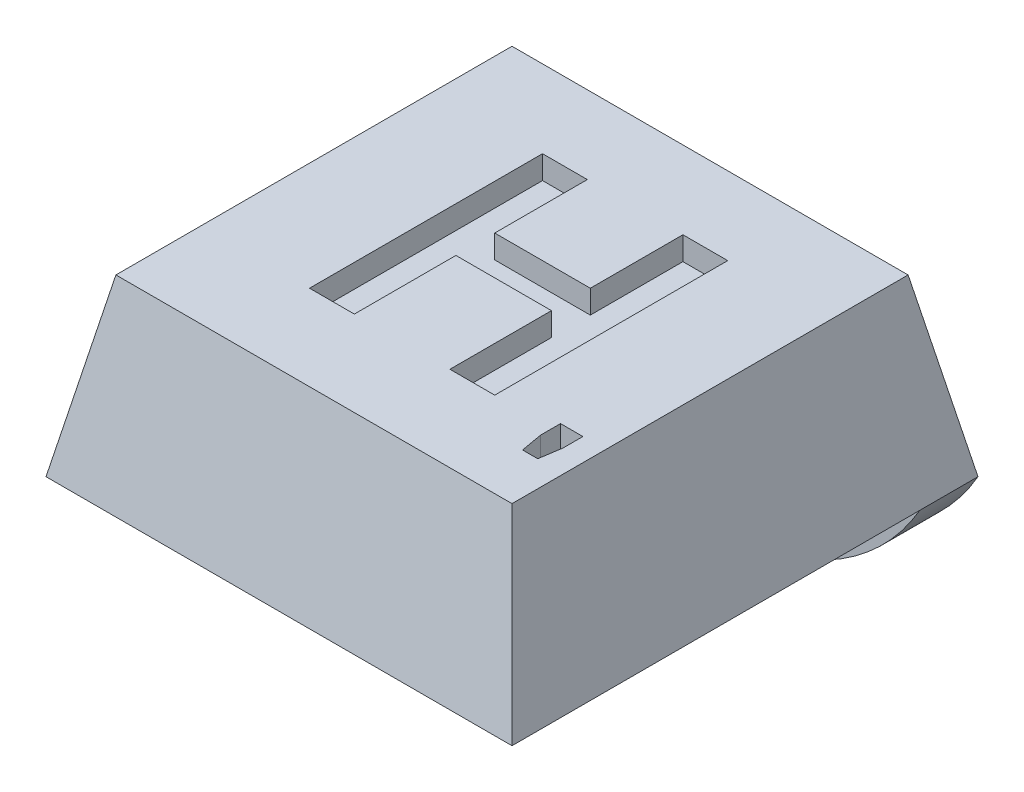
ISO-10303-21;
HEADER;
FILE_DESCRIPTION(('STEP AP214'),'2;1');
FILE_NAME('part.step','',(''),(''),'','','');
FILE_SCHEMA(('AUTOMOTIVE_DESIGN { 1 0 10303 214 1 1 1 1 }'));
ENDSEC;
DATA;
#1=APPLICATION_CONTEXT('core data for automotive mechanical design processes');
#2=APPLICATION_PROTOCOL_DEFINITION('international standard','automotive_design',2000,#1);
#3=PRODUCT_CONTEXT('',#1,'mechanical');
#4=PRODUCT('Part','Part','',(#3));
#5=PRODUCT_RELATED_PRODUCT_CATEGORY('part','',(#4));
#6=PRODUCT_DEFINITION_FORMATION('','',#4);
#7=PRODUCT_DEFINITION_CONTEXT('part definition',#1,'design');
#8=PRODUCT_DEFINITION('design','',#6,#7);
#9=PRODUCT_DEFINITION_SHAPE('','',#8);
#10=(LENGTH_UNIT() NAMED_UNIT(*) SI_UNIT(.MILLI.,.METRE.));
#11=(NAMED_UNIT(*) PLANE_ANGLE_UNIT() SI_UNIT($,.RADIAN.));
#12=(NAMED_UNIT(*) SI_UNIT($,.STERADIAN.) SOLID_ANGLE_UNIT());
#13=UNCERTAINTY_MEASURE_WITH_UNIT(LENGTH_MEASURE(1.E-05),#10,'distance_accuracy_value','');
#14=(GEOMETRIC_REPRESENTATION_CONTEXT(3) GLOBAL_UNCERTAINTY_ASSIGNED_CONTEXT((#13)) GLOBAL_UNIT_ASSIGNED_CONTEXT((#10,
#11,#12)) REPRESENTATION_CONTEXT('',''));
#15=CARTESIAN_POINT('',(0.,0.,0.));
#16=DIRECTION('',(0.,0.,1.));
#17=DIRECTION('',(1.,0.,0.));
#18=AXIS2_PLACEMENT_3D('',#15,#16,#17);
#19=CARTESIAN_POINT('',(0.,3.,0.));
#20=DIRECTION('',(0.,-1.,0.));
#21=DIRECTION('',(0.,0.,-1.));
#22=AXIS2_PLACEMENT_3D('',#19,#20,#21);
#23=PLANE('',#22);
#24=DIRECTION('',(-1.,0.,0.));
#25=VECTOR('',#24,1.);
#26=CARTESIAN_POINT('',(3.22863627000197,3.,-2.06454333683485));
#27=LINE('',#26,#25);
#28=CARTESIAN_POINT('',(3.22863627000197,3.,-2.06454333683485));
#29=VERTEX_POINT('',#28);
#30=CARTESIAN_POINT('',(2.4594055007712,3.,-2.06454333683485));
#31=VERTEX_POINT('',#30);
#32=EDGE_CURVE('E67',#29,#31,#27,.T.);
#33=ORIENTED_EDGE('',*,*,#32,.T.);
#34=DIRECTION('',(0.,0.,-1.));
#35=VECTOR('',#34,1.);
#36=CARTESIAN_POINT('',(2.4594055007712,3.,-2.06454333683485));
#37=LINE('',#36,#35);
#38=CARTESIAN_POINT('',(2.4594055007712,3.,-6.06454333683485));
#39=VERTEX_POINT('',#38);
#40=EDGE_CURVE('E240',#31,#39,#37,.T.);
#41=ORIENTED_EDGE('',*,*,#40,.T.);
#42=DIRECTION('',(1.,0.,0.));
#43=VECTOR('',#42,1.);
#44=CARTESIAN_POINT('',(2.4594055007712,3.,-6.06454333683485));
#45=LINE('',#44,#43);
#46=CARTESIAN_POINT('',(3.22863627000197,3.,-6.06454333683485));
#47=VERTEX_POINT('',#46);
#48=EDGE_CURVE('E288',#39,#47,#45,.T.);
#49=ORIENTED_EDGE('',*,*,#48,.T.);
#50=DIRECTION('',(0.,0.,1.));
#51=VECTOR('',#50,1.);
#52=CARTESIAN_POINT('',(3.22863627000197,3.,-6.06454333683485));
#53=LINE('',#52,#51);
#54=CARTESIAN_POINT('',(3.22863627000197,3.,-4.47479974709126));
#55=VERTEX_POINT('',#54);
#56=EDGE_CURVE('E292',#47,#55,#53,.T.);
#57=ORIENTED_EDGE('',*,*,#56,.T.);
#58=DIRECTION('',(1.,0.,0.));
#59=VECTOR('',#58,1.);
#60=CARTESIAN_POINT('',(3.22863627000197,3.,-4.47479974709126));
#61=LINE('',#60,#59);
#62=CARTESIAN_POINT('',(4.86966191102761,3.,-4.47479974709126));
#63=VERTEX_POINT('',#62);
#64=EDGE_CURVE('E296',#55,#63,#61,.T.);
#65=ORIENTED_EDGE('',*,*,#64,.T.);
#66=DIRECTION('',(0.,0.,-1.));
#67=VECTOR('',#66,1.);
#68=CARTESIAN_POINT('',(4.86966191102761,3.,-4.47479974709126));
#69=LINE('',#68,#67);
#70=CARTESIAN_POINT('',(4.86966191102761,3.,-6.06454333683485));
#71=VERTEX_POINT('',#70);
#72=EDGE_CURVE('E300',#63,#71,#69,.T.);
#73=ORIENTED_EDGE('',*,*,#72,.T.);
#74=DIRECTION('',(1.,0.,0.));
#75=VECTOR('',#74,1.);
#76=CARTESIAN_POINT('',(4.86966191102761,3.,-6.06454333683485));
#77=LINE('',#76,#75);
#78=CARTESIAN_POINT('',(5.63889268025838,3.,-6.06454333683485));
#79=VERTEX_POINT('',#78);
#80=EDGE_CURVE('E304',#71,#79,#77,.T.);
#81=ORIENTED_EDGE('',*,*,#80,.T.);
#82=DIRECTION('',(0.,0.,1.));
#83=VECTOR('',#82,1.);
#84=CARTESIAN_POINT('',(5.63889268025838,3.,-6.06454333683485));
#85=LINE('',#84,#83);
#86=CARTESIAN_POINT('',(5.63889268025838,3.,-2.06454333683485));
#87=VERTEX_POINT('',#86);
#88=EDGE_CURVE('E308',#79,#87,#85,.T.);
#89=ORIENTED_EDGE('',*,*,#88,.T.);
#90=DIRECTION('',(-1.,0.,0.));
#91=VECTOR('',#90,1.);
#92=CARTESIAN_POINT('',(5.63889268025838,3.,-2.06454333683485));
#93=LINE('',#92,#91);
#94=CARTESIAN_POINT('',(4.86966191102761,3.,-2.06454333683485));
#95=VERTEX_POINT('',#94);
#96=EDGE_CURVE('E312',#87,#95,#93,.T.);
#97=ORIENTED_EDGE('',*,*,#96,.T.);
#98=DIRECTION('',(0.,0.,-1.));
#99=VECTOR('',#98,1.);
#100=CARTESIAN_POINT('',(4.86966191102761,3.,-2.06454333683485));
#101=LINE('',#100,#99);
#102=CARTESIAN_POINT('',(4.86966191102761,3.,-3.80813308042459));
#103=VERTEX_POINT('',#102);
#104=EDGE_CURVE('E316',#95,#103,#101,.T.);
#105=ORIENTED_EDGE('',*,*,#104,.T.);
#106=DIRECTION('',(-1.,0.,0.));
#107=VECTOR('',#106,1.);
#108=CARTESIAN_POINT('',(4.86966191102761,3.,-3.80813308042459));
#109=LINE('',#108,#107);
#110=CARTESIAN_POINT('',(3.22863627000197,3.,-3.80813308042459));
#111=VERTEX_POINT('',#110);
#112=EDGE_CURVE('E320',#103,#111,#109,.T.);
#113=ORIENTED_EDGE('',*,*,#112,.T.);
#114=DIRECTION('',(0.,0.,1.));
#115=VECTOR('',#114,1.);
#116=CARTESIAN_POINT('',(3.22863627000197,3.,-3.80813308042459));
#117=LINE('',#116,#115);
#118=EDGE_CURVE('E251',#111,#29,#117,.T.);
#119=ORIENTED_EDGE('',*,*,#118,.T.);
#120=EDGE_LOOP('',(#33,#41,#49,#57,#65,#73,#81,#89,#97,#105,#113,#119));
#121=FACE_BOUND('',#120,.T.);
#122=DIRECTION('',(-1.,0.,0.));
#123=VECTOR('',#122,1.);
#124=CARTESIAN_POINT('',(11.,3.,-0.6));
#125=LINE('',#124,#123);
#126=CARTESIAN_POINT('',(7.4,3.,-0.6));
#127=VERTEX_POINT('',#126);
#128=CARTESIAN_POINT('',(0.6,3.,-0.6));
#129=VERTEX_POINT('',#128);
#130=EDGE_CURVE('E387',#127,#129,#125,.T.);
#131=ORIENTED_EDGE('',*,*,#130,.F.);
#132=DIRECTION('',(0.,0.,1.));
#133=VECTOR('',#132,1.);
#134=CARTESIAN_POINT('',(7.4,3.,-8.));
#135=LINE('',#134,#133);
#136=CARTESIAN_POINT('',(7.4,3.,-7.4));
#137=VERTEX_POINT('',#136);
#138=EDGE_CURVE('E400',#137,#127,#135,.T.);
#139=ORIENTED_EDGE('',*,*,#138,.F.);
#140=DIRECTION('',(-1.,0.,0.));
#141=VECTOR('',#140,1.);
#142=CARTESIAN_POINT('',(11.,3.,-7.4));
#143=LINE('',#142,#141);
#144=CARTESIAN_POINT('',(0.599999999999999,3.,-7.4));
#145=VERTEX_POINT('',#144);
#146=EDGE_CURVE('E383',#137,#145,#143,.T.);
#147=ORIENTED_EDGE('',*,*,#146,.T.);
#148=DIRECTION('',(0.,0.,1.));
#149=VECTOR('',#148,1.);
#150=CARTESIAN_POINT('',(0.6,3.,-8.));
#151=LINE('',#150,#149);
#152=EDGE_CURVE('E403',#145,#129,#151,.T.);
#153=ORIENTED_EDGE('',*,*,#152,.T.);
#154=EDGE_LOOP('',(#131,#139,#147,#153));
#155=FACE_BOUND('',#154,.T.);
#156=DIRECTION('',(-1.,0.,0.));
#157=VECTOR('',#156,1.);
#158=CARTESIAN_POINT('',(6.95345110897488,3.,-1.48827418732116));
#159=LINE('',#158,#157);
#160=CARTESIAN_POINT('',(6.95345110897488,3.,-1.48827418732116));
#161=VERTEX_POINT('',#160);
#162=CARTESIAN_POINT('',(6.69303444230821,3.,-1.48827418732116));
#163=VERTEX_POINT('',#162);
#164=EDGE_CURVE('E59',#161,#163,#159,.T.);
#165=ORIENTED_EDGE('',*,*,#164,.T.);
#166=DIRECTION('',(-0.174084452164286,0.,-0.984730726399182));
#167=VECTOR('',#166,1.);
#168=CARTESIAN_POINT('',(6.69303444230821,3.,-1.48827418732116));
#169=LINE('',#168,#167);
#170=CARTESIAN_POINT('',(6.6265280320518,3.,-1.86447611039809));
#171=VERTEX_POINT('',#170);
#172=EDGE_CURVE('E234',#163,#171,#169,.T.);
#173=ORIENTED_EDGE('',*,*,#172,.T.);
#174=DIRECTION('',(0.,0.,-1.));
#175=VECTOR('',#174,1.);
#176=CARTESIAN_POINT('',(6.6265280320518,3.,-1.86447611039809));
#177=LINE('',#176,#175);
#178=CARTESIAN_POINT('',(6.6265280320518,3.,-2.20622290526988));
#179=VERTEX_POINT('',#178);
#180=EDGE_CURVE('E507',#171,#179,#177,.T.);
#181=ORIENTED_EDGE('',*,*,#180,.T.);
#182=DIRECTION('',(1.,0.,0.));
#183=VECTOR('',#182,1.);
#184=CARTESIAN_POINT('',(6.6265280320518,3.,-2.20622290526988));
#185=LINE('',#184,#183);
#186=CARTESIAN_POINT('',(7.01114341666719,3.,-2.20622290526988));
#187=VERTEX_POINT('',#186);
#188=EDGE_CURVE('E515',#179,#187,#185,.T.);
#189=ORIENTED_EDGE('',*,*,#188,.T.);
#190=DIRECTION('',(0.,0.,1.));
#191=VECTOR('',#190,1.);
#192=CARTESIAN_POINT('',(7.01114341666719,3.,-2.20622290526988));
#193=LINE('',#192,#191);
#194=CARTESIAN_POINT('',(7.01114341666719,3.,-1.86447611039809));
#195=VERTEX_POINT('',#194);
#196=EDGE_CURVE('E519',#187,#195,#193,.T.);
#197=ORIENTED_EDGE('',*,*,#196,.T.);
#198=DIRECTION('',(-0.151582558519476,0.,0.98844460034576));
#199=VECTOR('',#198,1.);
#200=CARTESIAN_POINT('',(7.01114341666719,3.,-1.86447611039809));
#201=LINE('',#200,#199);
#202=EDGE_CURVE('E230',#195,#161,#201,.T.);
#203=ORIENTED_EDGE('',*,*,#202,.T.);
#204=EDGE_LOOP('',(#165,#173,#181,#189,#197,#203));
#205=FACE_BOUND('',#204,.T.);
#206=ADVANCED_FACE('F43',(#121,#155,#205),#23,.F.);
#207=CARTESIAN_POINT('',(8.,0.,-8.));
#208=DIRECTION('',(-0.98058067569092,-0.196116135138184,0.));
#209=DIRECTION('',(0.196116135138184,-0.98058067569092,0.));
#210=AXIS2_PLACEMENT_3D('',#207,#208,#209);
#211=PLANE('',#210);
#212=DIRECTION('',(-0.192450089729875,0.962250448649376,-0.192450089729875));
#213=VECTOR('',#212,1.);
#214=CARTESIAN_POINT('',(7.7037037037037,1.48148148148148,-0.296296296296296));
#215=LINE('',#214,#213);
#216=CARTESIAN_POINT('',(8.,0.,0.));
#217=VERTEX_POINT('',#216);
#218=EDGE_CURVE('E397',#217,#127,#215,.T.);
#219=ORIENTED_EDGE('',*,*,#218,.F.);
#220=DIRECTION('',(0.,0.,-1.));
#221=VECTOR('',#220,1.);
#222=CARTESIAN_POINT('',(8.,0.,0.));
#223=LINE('',#222,#221);
#224=CARTESIAN_POINT('',(8.,0.,-7.));
#225=VERTEX_POINT('',#224);
#226=EDGE_CURVE('E416',#217,#225,#223,.T.);
#227=ORIENTED_EDGE('',*,*,#226,.T.);
#228=DIRECTION('',(0.,0.,1.));
#229=VECTOR('',#228,1.);
#230=CARTESIAN_POINT('',(8.,0.,-8.));
#231=LINE('',#230,#229);
#232=CARTESIAN_POINT('',(8.,0.,-8.));
#233=VERTEX_POINT('',#232);
#234=EDGE_CURVE('E362',#233,#225,#231,.T.);
#235=ORIENTED_EDGE('',*,*,#234,.F.);
#236=DIRECTION('',(0.192450089729875,-0.962250448649376,-0.192450089729875));
#237=VECTOR('',#236,1.);
#238=CARTESIAN_POINT('',(8.,0.,-8.));
#239=LINE('',#238,#237);
#240=EDGE_CURVE('E390',#137,#233,#239,.T.);
#241=ORIENTED_EDGE('',*,*,#240,.F.);
#242=ORIENTED_EDGE('',*,*,#138,.T.);
#243=EDGE_LOOP('',(#219,#227,#235,#241,#242));
#244=FACE_BOUND('',#243,.T.);
#245=ADVANCED_FACE('F489',(#244),#211,.F.);
#246=CARTESIAN_POINT('',(0.,0.,-8.));
#247=DIRECTION('',(0.98058067569092,-0.196116135138184,0.));
#248=DIRECTION('',(0.196116135138184,0.98058067569092,0.));
#249=AXIS2_PLACEMENT_3D('',#246,#247,#248);
#250=PLANE('',#249);
#251=DIRECTION('',(-0.192450089729875,-0.962250448649376,0.192450089729875));
#252=VECTOR('',#251,1.);
#253=CARTESIAN_POINT('',(0.296296296296296,1.48148148148148,-0.296296296296296));
#254=LINE('',#253,#252);
#255=CARTESIAN_POINT('',(0.,0.,0.));
#256=VERTEX_POINT('',#255);
#257=EDGE_CURVE('E444',#129,#256,#254,.T.);
#258=ORIENTED_EDGE('',*,*,#257,.F.);
#259=ORIENTED_EDGE('',*,*,#152,.F.);
#260=DIRECTION('',(0.192450089729875,0.962250448649376,0.192450089729875));
#261=VECTOR('',#260,1.);
#262=CARTESIAN_POINT('',(0.,0.,-8.));
#263=LINE('',#262,#261);
#264=CARTESIAN_POINT('',(0.,0.,-8.));
#265=VERTEX_POINT('',#264);
#266=EDGE_CURVE('E415',#265,#145,#263,.T.);
#267=ORIENTED_EDGE('',*,*,#266,.F.);
#268=DIRECTION('',(0.,0.,1.));
#269=VECTOR('',#268,1.);
#270=CARTESIAN_POINT('',(0.,0.,0.));
#271=LINE('',#270,#269);
#272=CARTESIAN_POINT('',(0.,0.,-7.));
#273=VERTEX_POINT('',#272);
#274=EDGE_CURVE('E420',#265,#273,#271,.T.);
#275=ORIENTED_EDGE('',*,*,#274,.T.);
#276=EDGE_CURVE('E407',#273,#256,#271,.T.);
#277=ORIENTED_EDGE('',*,*,#276,.T.);
#278=EDGE_LOOP('',(#258,#259,#267,#275,#277));
#279=FACE_BOUND('',#278,.T.);
#280=ADVANCED_FACE('F469',(#279),#250,.F.);
#281=CARTESIAN_POINT('',(0.,0.,0.));
#282=DIRECTION('',(0.,-1.,0.));
#283=DIRECTION('',(0.,0.,-1.));
#284=AXIS2_PLACEMENT_3D('',#281,#282,#283);
#285=PLANE('',#284);
#286=DIRECTION('',(-1.,0.,0.));
#287=VECTOR('',#286,1.);
#288=CARTESIAN_POINT('',(0.,0.,-7.));
#289=LINE('',#288,#287);
#290=EDGE_CURVE('E368',#225,#273,#289,.T.);
#291=ORIENTED_EDGE('',*,*,#290,.F.);
#292=ORIENTED_EDGE('',*,*,#226,.F.);
#293=DIRECTION('',(1.,0.,0.));
#294=VECTOR('',#293,1.);
#295=CARTESIAN_POINT('',(0.,0.,0.));
#296=LINE('',#295,#294);
#297=EDGE_CURVE('E417',#256,#217,#296,.T.);
#298=ORIENTED_EDGE('',*,*,#297,.F.);
#299=ORIENTED_EDGE('',*,*,#276,.F.);
#300=EDGE_LOOP('',(#291,#292,#298,#299));
#301=FACE_BOUND('',#300,.T.);
#302=CARTESIAN_POINT('',(4.,0.,-3.75));
#303=DIRECTION('',(0.,-1.,0.));
#304=DIRECTION('',(0.,0.,-1.));
#305=AXIS2_PLACEMENT_3D('',#302,#303,#304);
#306=CIRCLE('',#305,1.75);
#307=CARTESIAN_POINT('',(4.,0.,-5.5));
#308=VERTEX_POINT('',#307);
#309=EDGE_CURVE('E372',#308,#308,#306,.T.);
#310=ORIENTED_EDGE('',*,*,#309,.F.);
#311=EDGE_LOOP('',(#310));
#312=FACE_BOUND('',#311,.T.);
#313=ADVANCED_FACE('F484',(#301,#312),#285,.T.);
#314=CARTESIAN_POINT('',(11.,3.,-7.4));
#315=DIRECTION('',(0.,0.196116135138184,-0.98058067569092));
#316=DIRECTION('',(0.,0.98058067569092,0.196116135138184));
#317=AXIS2_PLACEMENT_3D('',#314,#315,#316);
#318=PLANE('',#317);
#319=ORIENTED_EDGE('',*,*,#240,.T.);
#320=DIRECTION('',(-1.,0.,0.));
#321=VECTOR('',#320,1.);
#322=CARTESIAN_POINT('',(0.,0.,-8.));
#323=LINE('',#322,#321);
#324=EDGE_CURVE('E411',#233,#265,#323,.T.);
#325=ORIENTED_EDGE('',*,*,#324,.T.);
#326=ORIENTED_EDGE('',*,*,#266,.T.);
#327=ORIENTED_EDGE('',*,*,#146,.F.);
#328=EDGE_LOOP('',(#319,#325,#326,#327));
#329=FACE_BOUND('',#328,.T.);
#330=ADVANCED_FACE('F464',(#329),#318,.T.);
#331=CARTESIAN_POINT('',(11.,0.,0.));
#332=DIRECTION('',(0.,0.196116135138184,0.98058067569092));
#333=DIRECTION('',(0.,-0.98058067569092,0.196116135138184));
#334=AXIS2_PLACEMENT_3D('',#331,#332,#333);
#335=PLANE('',#334);
#336=ORIENTED_EDGE('',*,*,#218,.T.);
#337=ORIENTED_EDGE('',*,*,#130,.T.);
#338=ORIENTED_EDGE('',*,*,#257,.T.);
#339=ORIENTED_EDGE('',*,*,#297,.T.);
#340=EDGE_LOOP('',(#336,#337,#338,#339));
#341=FACE_BOUND('',#340,.T.);
#342=ADVANCED_FACE('F493',(#341),#335,.T.);
#343=CARTESIAN_POINT('',(4.,0.4,-3.75));
#344=DIRECTION('',(0.,-1.,0.));
#345=DIRECTION('',(0.,0.,-1.));
#346=AXIS2_PLACEMENT_3D('',#343,#344,#345);
#347=CYLINDRICAL_SURFACE('',#346,1.75);
#348=CARTESIAN_POINT('',(4.,0.4,-3.75));
#349=DIRECTION('',(0.,-1.,0.));
#350=DIRECTION('',(0.,0.,-1.));
#351=AXIS2_PLACEMENT_3D('',#348,#349,#350);
#352=CIRCLE('',#351,1.75);
#353=CARTESIAN_POINT('',(4.,0.4,-5.5));
#354=VERTEX_POINT('',#353);
#355=EDGE_CURVE('E379',#354,#354,#352,.T.);
#356=ORIENTED_EDGE('',*,*,#355,.F.);
#357=EDGE_LOOP('',(#356));
#358=FACE_BOUND('',#357,.T.);
#359=ORIENTED_EDGE('',*,*,#309,.T.);
#360=EDGE_LOOP('',(#359));
#361=FACE_BOUND('',#360,.T.);
#362=ADVANCED_FACE('F632',(#358,#361),#347,.F.);
#363=CARTESIAN_POINT('',(4.,0.4,-3.75));
#364=DIRECTION('',(0.,-1.,0.));
#365=DIRECTION('',(0.,0.,-1.));
#366=AXIS2_PLACEMENT_3D('',#363,#364,#365);
#367=PLANE('',#366);
#368=ORIENTED_EDGE('',*,*,#355,.T.);
#369=EDGE_LOOP('',(#368));
#370=FACE_BOUND('',#369,.T.);
#371=ADVANCED_FACE('F629',(#370),#367,.T.);
#372=CARTESIAN_POINT('',(0.,-2.,-8.));
#373=DIRECTION('',(0.,0.,1.));
#374=DIRECTION('',(1.,0.,0.));
#375=AXIS2_PLACEMENT_3D('',#372,#373,#374);
#376=PLANE('',#375);
#377=ORIENTED_EDGE('',*,*,#324,.F.);
#378=CARTESIAN_POINT('',(4.53589838486225,2.,-8.));
#379=DIRECTION('',(0.,0.,1.));
#380=DIRECTION('',(1.,0.,0.));
#381=AXIS2_PLACEMENT_3D('',#378,#379,#380);
#382=CIRCLE('',#381,4.);
#383=CARTESIAN_POINT('',(4.53589838486225,-2.,-8.));
#384=VERTEX_POINT('',#383);
#385=EDGE_CURVE('E11',#233,#384,#382,.F.);
#386=ORIENTED_EDGE('',*,*,#385,.T.);
#387=DIRECTION('',(1.,0.,0.));
#388=VECTOR('',#387,1.);
#389=CARTESIAN_POINT('',(0.,-2.,-8.));
#390=LINE('',#389,#388);
#391=CARTESIAN_POINT('',(3.46410161513775,-2.,-8.));
#392=VERTEX_POINT('',#391);
#393=EDGE_CURVE('E363',#392,#384,#390,.T.);
#394=ORIENTED_EDGE('',*,*,#393,.F.);
#395=CARTESIAN_POINT('',(3.46410161513775,2.,-8.));
#396=DIRECTION('',(0.,0.,1.));
#397=DIRECTION('',(1.,0.,0.));
#398=AXIS2_PLACEMENT_3D('',#395,#396,#397);
#399=CIRCLE('',#398,4.);
#400=EDGE_CURVE('E52',#392,#265,#399,.F.);
#401=ORIENTED_EDGE('',*,*,#400,.T.);
#402=EDGE_LOOP('',(#377,#386,#394,#401));
#403=FACE_BOUND('',#402,.T.);
#404=ADVANCED_FACE('F457',(#403),#376,.F.);
#405=CARTESIAN_POINT('',(0.,-2.,-7.));
#406=DIRECTION('',(0.,0.,-1.));
#407=DIRECTION('',(-1.,0.,0.));
#408=AXIS2_PLACEMENT_3D('',#405,#406,#407);
#409=PLANE('',#408);
#410=DIRECTION('',(-1.,0.,0.));
#411=VECTOR('',#410,1.);
#412=CARTESIAN_POINT('',(0.,-2.,-7.));
#413=LINE('',#412,#411);
#414=CARTESIAN_POINT('',(4.53589838486225,-2.,-7.));
#415=VERTEX_POINT('',#414);
#416=CARTESIAN_POINT('',(3.46410161513775,-2.,-7.));
#417=VERTEX_POINT('',#416);
#418=EDGE_CURVE('E367',#415,#417,#413,.T.);
#419=ORIENTED_EDGE('',*,*,#418,.F.);
#420=CARTESIAN_POINT('',(4.53589838486225,2.,-7.));
#421=DIRECTION('',(0.,0.,-1.));
#422=DIRECTION('',(-1.,0.,0.));
#423=AXIS2_PLACEMENT_3D('',#420,#421,#422);
#424=CIRCLE('',#423,4.);
#425=EDGE_CURVE('E451',#415,#225,#424,.F.);
#426=ORIENTED_EDGE('',*,*,#425,.T.);
#427=ORIENTED_EDGE('',*,*,#290,.T.);
#428=CARTESIAN_POINT('',(3.46410161513775,2.,-7.));
#429=DIRECTION('',(0.,0.,-1.));
#430=DIRECTION('',(-1.,0.,0.));
#431=AXIS2_PLACEMENT_3D('',#428,#429,#430);
#432=CIRCLE('',#431,4.);
#433=EDGE_CURVE('E448',#273,#417,#432,.F.);
#434=ORIENTED_EDGE('',*,*,#433,.T.);
#435=EDGE_LOOP('',(#419,#426,#427,#434));
#436=FACE_BOUND('',#435,.T.);
#437=ADVANCED_FACE('F475',(#436),#409,.F.);
#438=CARTESIAN_POINT('',(0.,-2.,0.));
#439=DIRECTION('',(0.,1.,0.));
#440=DIRECTION('',(0.,0.,1.));
#441=AXIS2_PLACEMENT_3D('',#438,#439,#440);
#442=PLANE('',#441);
#443=ORIENTED_EDGE('',*,*,#393,.T.);
#444=DIRECTION('',(0.,0.,1.));
#445=VECTOR('',#444,1.);
#446=CARTESIAN_POINT('',(4.53589838486225,-2.,0.));
#447=LINE('',#446,#445);
#448=EDGE_CURVE('E443',#384,#415,#447,.T.);
#449=ORIENTED_EDGE('',*,*,#448,.T.);
#450=ORIENTED_EDGE('',*,*,#418,.T.);
#451=DIRECTION('',(0.,0.,-1.));
#452=VECTOR('',#451,1.);
#453=CARTESIAN_POINT('',(3.46410161513775,-2.,0.));
#454=LINE('',#453,#452);
#455=EDGE_CURVE('E439',#417,#392,#454,.T.);
#456=ORIENTED_EDGE('',*,*,#455,.T.);
#457=EDGE_LOOP('',(#443,#449,#450,#456));
#458=FACE_BOUND('',#457,.T.);
#459=ADVANCED_FACE('F478',(#458),#442,.F.);
#460=CARTESIAN_POINT('',(4.53589838486225,2.,-8.));
#461=DIRECTION('',(0.,0.,1.));
#462=DIRECTION('',(1.,0.,0.));
#463=AXIS2_PLACEMENT_3D('',#460,#461,#462);
#464=CYLINDRICAL_SURFACE('',#463,4.);
#465=ORIENTED_EDGE('',*,*,#385,.F.);
#466=ORIENTED_EDGE('',*,*,#234,.T.);
#467=ORIENTED_EDGE('',*,*,#425,.F.);
#468=ORIENTED_EDGE('',*,*,#448,.F.);
#469=EDGE_LOOP('',(#465,#466,#467,#468));
#470=FACE_BOUND('',#469,.T.);
#471=ADVANCED_FACE('F481',(#470),#464,.T.);
#472=CARTESIAN_POINT('',(3.46410161513775,2.,-8.));
#473=DIRECTION('',(0.,0.,-1.));
#474=DIRECTION('',(-1.,0.,0.));
#475=AXIS2_PLACEMENT_3D('',#472,#473,#474);
#476=CYLINDRICAL_SURFACE('',#475,4.);
#477=ORIENTED_EDGE('',*,*,#433,.F.);
#478=ORIENTED_EDGE('',*,*,#274,.F.);
#479=ORIENTED_EDGE('',*,*,#400,.F.);
#480=ORIENTED_EDGE('',*,*,#455,.F.);
#481=EDGE_LOOP('',(#477,#478,#479,#480));
#482=FACE_BOUND('',#481,.T.);
#483=ADVANCED_FACE('F45',(#482),#476,.T.);
#484=CARTESIAN_POINT('',(3.22863627000197,2.6,-2.06454333683485));
#485=DIRECTION('',(0.,0.,-1.));
#486=DIRECTION('',(-1.,0.,0.));
#487=AXIS2_PLACEMENT_3D('',#484,#485,#486);
#488=PLANE('',#487);
#489=ORIENTED_EDGE('',*,*,#32,.F.);
#490=DIRECTION('',(0.,1.,0.));
#491=VECTOR('',#490,1.);
#492=CARTESIAN_POINT('',(3.22863627000197,2.6,-2.06454333683485));
#493=LINE('',#492,#491);
#494=CARTESIAN_POINT('',(3.22863627000197,2.6,-2.06454333683485));
#495=VERTEX_POINT('',#494);
#496=EDGE_CURVE('E283',#495,#29,#493,.T.);
#497=ORIENTED_EDGE('',*,*,#496,.F.);
#498=DIRECTION('',(-1.,0.,0.));
#499=VECTOR('',#498,1.);
#500=CARTESIAN_POINT('',(3.22863627000197,2.6,-2.06454333683485));
#501=LINE('',#500,#499);
#502=CARTESIAN_POINT('',(2.4594055007712,2.6,-2.06454333683485));
#503=VERTEX_POINT('',#502);
#504=EDGE_CURVE('E246',#495,#503,#501,.T.);
#505=ORIENTED_EDGE('',*,*,#504,.T.);
#506=DIRECTION('',(0.,1.,0.));
#507=VECTOR('',#506,1.);
#508=CARTESIAN_POINT('',(2.4594055007712,2.6,-2.06454333683485));
#509=LINE('',#508,#507);
#510=EDGE_CURVE('E359',#503,#31,#509,.T.);
#511=ORIENTED_EDGE('',*,*,#510,.T.);
#512=EDGE_LOOP('',(#489,#497,#505,#511));
#513=FACE_BOUND('',#512,.T.);
#514=ADVANCED_FACE('F619',(#513),#488,.T.);
#515=CARTESIAN_POINT('',(2.4594055007712,2.6,-2.06454333683485));
#516=DIRECTION('',(1.,0.,0.));
#517=DIRECTION('',(0.,0.,-1.));
#518=AXIS2_PLACEMENT_3D('',#515,#516,#517);
#519=PLANE('',#518);
#520=ORIENTED_EDGE('',*,*,#40,.F.);
#521=ORIENTED_EDGE('',*,*,#510,.F.);
#522=DIRECTION('',(0.,0.,-1.));
#523=VECTOR('',#522,1.);
#524=CARTESIAN_POINT('',(2.4594055007712,2.6,-2.06454333683485));
#525=LINE('',#524,#523);
#526=CARTESIAN_POINT('',(2.4594055007712,2.6,-6.06454333683485));
#527=VERTEX_POINT('',#526);
#528=EDGE_CURVE('E250',#503,#527,#525,.T.);
#529=ORIENTED_EDGE('',*,*,#528,.T.);
#530=DIRECTION('',(0.,1.,0.));
#531=VECTOR('',#530,1.);
#532=CARTESIAN_POINT('',(2.4594055007712,2.6,-6.06454333683485));
#533=LINE('',#532,#531);
#534=EDGE_CURVE('E356',#527,#39,#533,.T.);
#535=ORIENTED_EDGE('',*,*,#534,.T.);
#536=EDGE_LOOP('',(#520,#521,#529,#535));
#537=FACE_BOUND('',#536,.T.);
#538=ADVANCED_FACE('F615',(#537),#519,.T.);
#539=CARTESIAN_POINT('',(2.4594055007712,2.6,-6.06454333683485));
#540=DIRECTION('',(0.,0.,1.));
#541=DIRECTION('',(1.,0.,0.));
#542=AXIS2_PLACEMENT_3D('',#539,#540,#541);
#543=PLANE('',#542);
#544=ORIENTED_EDGE('',*,*,#48,.F.);
#545=ORIENTED_EDGE('',*,*,#534,.F.);
#546=DIRECTION('',(1.,0.,0.));
#547=VECTOR('',#546,1.);
#548=CARTESIAN_POINT('',(2.4594055007712,2.6,-6.06454333683485));
#549=LINE('',#548,#547);
#550=CARTESIAN_POINT('',(3.22863627000197,2.6,-6.06454333683485));
#551=VERTEX_POINT('',#550);
#552=EDGE_CURVE('E254',#527,#551,#549,.T.);
#553=ORIENTED_EDGE('',*,*,#552,.T.);
#554=DIRECTION('',(0.,1.,0.));
#555=VECTOR('',#554,1.);
#556=CARTESIAN_POINT('',(3.22863627000197,2.6,-6.06454333683485));
#557=LINE('',#556,#555);
#558=EDGE_CURVE('E353',#551,#47,#557,.T.);
#559=ORIENTED_EDGE('',*,*,#558,.T.);
#560=EDGE_LOOP('',(#544,#545,#553,#559));
#561=FACE_BOUND('',#560,.T.);
#562=ADVANCED_FACE('F611',(#561),#543,.T.);
#563=CARTESIAN_POINT('',(3.22863627000197,2.6,-6.06454333683485));
#564=DIRECTION('',(-1.,0.,0.));
#565=DIRECTION('',(0.,0.,1.));
#566=AXIS2_PLACEMENT_3D('',#563,#564,#565);
#567=PLANE('',#566);
#568=ORIENTED_EDGE('',*,*,#56,.F.);
#569=ORIENTED_EDGE('',*,*,#558,.F.);
#570=DIRECTION('',(0.,0.,1.));
#571=VECTOR('',#570,1.);
#572=CARTESIAN_POINT('',(3.22863627000197,2.6,-6.06454333683485));
#573=LINE('',#572,#571);
#574=CARTESIAN_POINT('',(3.22863627000197,2.6,-4.47479974709126));
#575=VERTEX_POINT('',#574);
#576=EDGE_CURVE('E257',#551,#575,#573,.T.);
#577=ORIENTED_EDGE('',*,*,#576,.T.);
#578=DIRECTION('',(0.,1.,0.));
#579=VECTOR('',#578,1.);
#580=CARTESIAN_POINT('',(3.22863627000197,2.6,-4.47479974709126));
#581=LINE('',#580,#579);
#582=EDGE_CURVE('E350',#575,#55,#581,.T.);
#583=ORIENTED_EDGE('',*,*,#582,.T.);
#584=EDGE_LOOP('',(#568,#569,#577,#583));
#585=FACE_BOUND('',#584,.T.);
#586=ADVANCED_FACE('F607',(#585),#567,.T.);
#587=CARTESIAN_POINT('',(3.22863627000197,2.6,-4.47479974709126));
#588=DIRECTION('',(0.,0.,1.));
#589=DIRECTION('',(1.,0.,0.));
#590=AXIS2_PLACEMENT_3D('',#587,#588,#589);
#591=PLANE('',#590);
#592=ORIENTED_EDGE('',*,*,#64,.F.);
#593=ORIENTED_EDGE('',*,*,#582,.F.);
#594=DIRECTION('',(1.,0.,0.));
#595=VECTOR('',#594,1.);
#596=CARTESIAN_POINT('',(3.22863627000197,2.6,-4.47479974709126));
#597=LINE('',#596,#595);
#598=CARTESIAN_POINT('',(4.86966191102761,2.6,-4.47479974709126));
#599=VERTEX_POINT('',#598);
#600=EDGE_CURVE('E260',#575,#599,#597,.T.);
#601=ORIENTED_EDGE('',*,*,#600,.T.);
#602=DIRECTION('',(0.,1.,0.));
#603=VECTOR('',#602,1.);
#604=CARTESIAN_POINT('',(4.86966191102761,2.6,-4.47479974709126));
#605=LINE('',#604,#603);
#606=EDGE_CURVE('E347',#599,#63,#605,.T.);
#607=ORIENTED_EDGE('',*,*,#606,.T.);
#608=EDGE_LOOP('',(#592,#593,#601,#607));
#609=FACE_BOUND('',#608,.T.);
#610=ADVANCED_FACE('F603',(#609),#591,.T.);
#611=CARTESIAN_POINT('',(4.86966191102761,2.6,-4.47479974709126));
#612=DIRECTION('',(1.,0.,0.));
#613=DIRECTION('',(0.,0.,-1.));
#614=AXIS2_PLACEMENT_3D('',#611,#612,#613);
#615=PLANE('',#614);
#616=ORIENTED_EDGE('',*,*,#72,.F.);
#617=ORIENTED_EDGE('',*,*,#606,.F.);
#618=DIRECTION('',(0.,0.,-1.));
#619=VECTOR('',#618,1.);
#620=CARTESIAN_POINT('',(4.86966191102761,2.6,-4.47479974709126));
#621=LINE('',#620,#619);
#622=CARTESIAN_POINT('',(4.86966191102761,2.6,-6.06454333683485));
#623=VERTEX_POINT('',#622);
#624=EDGE_CURVE('E263',#599,#623,#621,.T.);
#625=ORIENTED_EDGE('',*,*,#624,.T.);
#626=DIRECTION('',(0.,1.,0.));
#627=VECTOR('',#626,1.);
#628=CARTESIAN_POINT('',(4.86966191102761,2.6,-6.06454333683485));
#629=LINE('',#628,#627);
#630=EDGE_CURVE('E344',#623,#71,#629,.T.);
#631=ORIENTED_EDGE('',*,*,#630,.T.);
#632=EDGE_LOOP('',(#616,#617,#625,#631));
#633=FACE_BOUND('',#632,.T.);
#634=ADVANCED_FACE('F599',(#633),#615,.T.);
#635=CARTESIAN_POINT('',(4.86966191102761,2.6,-6.06454333683485));
#636=DIRECTION('',(0.,0.,1.));
#637=DIRECTION('',(1.,0.,0.));
#638=AXIS2_PLACEMENT_3D('',#635,#636,#637);
#639=PLANE('',#638);
#640=ORIENTED_EDGE('',*,*,#80,.F.);
#641=ORIENTED_EDGE('',*,*,#630,.F.);
#642=DIRECTION('',(1.,0.,0.));
#643=VECTOR('',#642,1.);
#644=CARTESIAN_POINT('',(4.86966191102761,2.6,-6.06454333683485));
#645=LINE('',#644,#643);
#646=CARTESIAN_POINT('',(5.63889268025838,2.6,-6.06454333683485));
#647=VERTEX_POINT('',#646);
#648=EDGE_CURVE('E266',#623,#647,#645,.T.);
#649=ORIENTED_EDGE('',*,*,#648,.T.);
#650=DIRECTION('',(0.,1.,0.));
#651=VECTOR('',#650,1.);
#652=CARTESIAN_POINT('',(5.63889268025838,2.6,-6.06454333683485));
#653=LINE('',#652,#651);
#654=EDGE_CURVE('E341',#647,#79,#653,.T.);
#655=ORIENTED_EDGE('',*,*,#654,.T.);
#656=EDGE_LOOP('',(#640,#641,#649,#655));
#657=FACE_BOUND('',#656,.T.);
#658=ADVANCED_FACE('F595',(#657),#639,.T.);
#659=CARTESIAN_POINT('',(5.63889268025838,2.6,-6.06454333683485));
#660=DIRECTION('',(-1.,0.,0.));
#661=DIRECTION('',(0.,0.,1.));
#662=AXIS2_PLACEMENT_3D('',#659,#660,#661);
#663=PLANE('',#662);
#664=ORIENTED_EDGE('',*,*,#88,.F.);
#665=ORIENTED_EDGE('',*,*,#654,.F.);
#666=DIRECTION('',(0.,0.,1.));
#667=VECTOR('',#666,1.);
#668=CARTESIAN_POINT('',(5.63889268025838,2.6,-6.06454333683485));
#669=LINE('',#668,#667);
#670=CARTESIAN_POINT('',(5.63889268025838,2.6,-2.06454333683485));
#671=VERTEX_POINT('',#670);
#672=EDGE_CURVE('E269',#647,#671,#669,.T.);
#673=ORIENTED_EDGE('',*,*,#672,.T.);
#674=DIRECTION('',(0.,1.,0.));
#675=VECTOR('',#674,1.);
#676=CARTESIAN_POINT('',(5.63889268025838,2.6,-2.06454333683485));
#677=LINE('',#676,#675);
#678=EDGE_CURVE('E338',#671,#87,#677,.T.);
#679=ORIENTED_EDGE('',*,*,#678,.T.);
#680=EDGE_LOOP('',(#664,#665,#673,#679));
#681=FACE_BOUND('',#680,.T.);
#682=ADVANCED_FACE('F591',(#681),#663,.T.);
#683=CARTESIAN_POINT('',(5.63889268025838,2.6,-2.06454333683485));
#684=DIRECTION('',(0.,0.,-1.));
#685=DIRECTION('',(-1.,0.,0.));
#686=AXIS2_PLACEMENT_3D('',#683,#684,#685);
#687=PLANE('',#686);
#688=ORIENTED_EDGE('',*,*,#96,.F.);
#689=ORIENTED_EDGE('',*,*,#678,.F.);
#690=DIRECTION('',(-1.,0.,0.));
#691=VECTOR('',#690,1.);
#692=CARTESIAN_POINT('',(5.63889268025838,2.6,-2.06454333683485));
#693=LINE('',#692,#691);
#694=CARTESIAN_POINT('',(4.86966191102761,2.6,-2.06454333683485));
#695=VERTEX_POINT('',#694);
#696=EDGE_CURVE('E272',#671,#695,#693,.T.);
#697=ORIENTED_EDGE('',*,*,#696,.T.);
#698=DIRECTION('',(0.,1.,0.));
#699=VECTOR('',#698,1.);
#700=CARTESIAN_POINT('',(4.86966191102761,2.6,-2.06454333683485));
#701=LINE('',#700,#699);
#702=EDGE_CURVE('E335',#695,#95,#701,.T.);
#703=ORIENTED_EDGE('',*,*,#702,.T.);
#704=EDGE_LOOP('',(#688,#689,#697,#703));
#705=FACE_BOUND('',#704,.T.);
#706=ADVANCED_FACE('F587',(#705),#687,.T.);
#707=CARTESIAN_POINT('',(4.86966191102761,2.6,-2.06454333683485));
#708=DIRECTION('',(1.,0.,0.));
#709=DIRECTION('',(0.,0.,-1.));
#710=AXIS2_PLACEMENT_3D('',#707,#708,#709);
#711=PLANE('',#710);
#712=ORIENTED_EDGE('',*,*,#104,.F.);
#713=ORIENTED_EDGE('',*,*,#702,.F.);
#714=DIRECTION('',(0.,0.,-1.));
#715=VECTOR('',#714,1.);
#716=CARTESIAN_POINT('',(4.86966191102761,2.6,-2.06454333683485));
#717=LINE('',#716,#715);
#718=CARTESIAN_POINT('',(4.86966191102761,2.6,-3.80813308042459));
#719=VERTEX_POINT('',#718);
#720=EDGE_CURVE('E275',#695,#719,#717,.T.);
#721=ORIENTED_EDGE('',*,*,#720,.T.);
#722=DIRECTION('',(0.,1.,0.));
#723=VECTOR('',#722,1.);
#724=CARTESIAN_POINT('',(4.86966191102761,2.6,-3.80813308042459));
#725=LINE('',#724,#723);
#726=EDGE_CURVE('E332',#719,#103,#725,.T.);
#727=ORIENTED_EDGE('',*,*,#726,.T.);
#728=EDGE_LOOP('',(#712,#713,#721,#727));
#729=FACE_BOUND('',#728,.T.);
#730=ADVANCED_FACE('F583',(#729),#711,.T.);
#731=CARTESIAN_POINT('',(4.86966191102761,2.6,-3.80813308042459));
#732=DIRECTION('',(0.,0.,-1.));
#733=DIRECTION('',(-1.,0.,0.));
#734=AXIS2_PLACEMENT_3D('',#731,#732,#733);
#735=PLANE('',#734);
#736=ORIENTED_EDGE('',*,*,#112,.F.);
#737=ORIENTED_EDGE('',*,*,#726,.F.);
#738=DIRECTION('',(-1.,0.,0.));
#739=VECTOR('',#738,1.);
#740=CARTESIAN_POINT('',(4.86966191102761,2.6,-3.80813308042459));
#741=LINE('',#740,#739);
#742=CARTESIAN_POINT('',(3.22863627000197,2.6,-3.80813308042459));
#743=VERTEX_POINT('',#742);
#744=EDGE_CURVE('E278',#719,#743,#741,.T.);
#745=ORIENTED_EDGE('',*,*,#744,.T.);
#746=DIRECTION('',(0.,1.,0.));
#747=VECTOR('',#746,1.);
#748=CARTESIAN_POINT('',(3.22863627000197,2.6,-3.80813308042459));
#749=LINE('',#748,#747);
#750=EDGE_CURVE('E329',#743,#111,#749,.T.);
#751=ORIENTED_EDGE('',*,*,#750,.T.);
#752=EDGE_LOOP('',(#736,#737,#745,#751));
#753=FACE_BOUND('',#752,.T.);
#754=ADVANCED_FACE('F579',(#753),#735,.T.);
#755=CARTESIAN_POINT('',(3.22863627000197,2.6,-3.80813308042459));
#756=DIRECTION('',(-1.,0.,0.));
#757=DIRECTION('',(0.,0.,1.));
#758=AXIS2_PLACEMENT_3D('',#755,#756,#757);
#759=PLANE('',#758);
#760=ORIENTED_EDGE('',*,*,#118,.F.);
#761=ORIENTED_EDGE('',*,*,#750,.F.);
#762=DIRECTION('',(0.,0.,1.));
#763=VECTOR('',#762,1.);
#764=CARTESIAN_POINT('',(3.22863627000197,2.6,-3.80813308042459));
#765=LINE('',#764,#763);
#766=EDGE_CURVE('E281',#743,#495,#765,.T.);
#767=ORIENTED_EDGE('',*,*,#766,.T.);
#768=ORIENTED_EDGE('',*,*,#496,.T.);
#769=EDGE_LOOP('',(#760,#761,#767,#768));
#770=FACE_BOUND('',#769,.T.);
#771=ADVANCED_FACE('F575',(#770),#759,.T.);
#772=CARTESIAN_POINT('',(0.,2.6,0.));
#773=DIRECTION('',(0.,-1.,0.));
#774=DIRECTION('',(0.,0.,-1.));
#775=AXIS2_PLACEMENT_3D('',#772,#773,#774);
#776=PLANE('',#775);
#777=ORIENTED_EDGE('',*,*,#504,.F.);
#778=ORIENTED_EDGE('',*,*,#766,.F.);
#779=ORIENTED_EDGE('',*,*,#744,.F.);
#780=ORIENTED_EDGE('',*,*,#720,.F.);
#781=ORIENTED_EDGE('',*,*,#696,.F.);
#782=ORIENTED_EDGE('',*,*,#672,.F.);
#783=ORIENTED_EDGE('',*,*,#648,.F.);
#784=ORIENTED_EDGE('',*,*,#624,.F.);
#785=ORIENTED_EDGE('',*,*,#600,.F.);
#786=ORIENTED_EDGE('',*,*,#576,.F.);
#787=ORIENTED_EDGE('',*,*,#552,.F.);
#788=ORIENTED_EDGE('',*,*,#528,.F.);
#789=EDGE_LOOP('',(#777,#778,#779,#780,#781,#782,#783,#784,#785,#786,#787,#788));
#790=FACE_BOUND('',#789,.T.);
#791=ADVANCED_FACE('F572',(#790),#776,.F.);
#792=CARTESIAN_POINT('',(6.95345110897488,2.5,-1.48827418732116));
#793=DIRECTION('',(0.,0.,-1.));
#794=DIRECTION('',(-1.,0.,0.));
#795=AXIS2_PLACEMENT_3D('',#792,#793,#794);
#796=PLANE('',#795);
#797=ORIENTED_EDGE('',*,*,#164,.F.);
#798=DIRECTION('',(0.,1.,0.));
#799=VECTOR('',#798,1.);
#800=CARTESIAN_POINT('',(6.95345110897488,2.5,-1.48827418732116));
#801=LINE('',#800,#799);
#802=CARTESIAN_POINT('',(6.95345110897488,2.5,-1.48827418732116));
#803=VERTEX_POINT('',#802);
#804=EDGE_CURVE('E228',#803,#161,#801,.T.);
#805=ORIENTED_EDGE('',*,*,#804,.F.);
#806=DIRECTION('',(-1.,0.,0.));
#807=VECTOR('',#806,1.);
#808=CARTESIAN_POINT('',(6.95345110897488,2.5,-1.48827418732116));
#809=LINE('',#808,#807);
#810=CARTESIAN_POINT('',(6.69303444230821,2.5,-1.48827418732116));
#811=VERTEX_POINT('',#810);
#812=EDGE_CURVE('E218',#803,#811,#809,.T.);
#813=ORIENTED_EDGE('',*,*,#812,.T.);
#814=DIRECTION('',(0.,1.,0.));
#815=VECTOR('',#814,1.);
#816=CARTESIAN_POINT('',(6.69303444230821,2.5,-1.48827418732116));
#817=LINE('',#816,#815);
#818=EDGE_CURVE('E227',#811,#163,#817,.T.);
#819=ORIENTED_EDGE('',*,*,#818,.T.);
#820=EDGE_LOOP('',(#797,#805,#813,#819));
#821=FACE_BOUND('',#820,.T.);
#822=ADVANCED_FACE('F226',(#821),#796,.T.);
#823=CARTESIAN_POINT('',(6.69303444230821,2.5,-1.48827418732116));
#824=DIRECTION('',(0.984730726399182,0.,-0.174084452164286));
#825=DIRECTION('',(-0.174084452164286,0.,-0.984730726399182));
#826=AXIS2_PLACEMENT_3D('',#823,#824,#825);
#827=PLANE('',#826);
#828=ORIENTED_EDGE('',*,*,#172,.F.);
#829=ORIENTED_EDGE('',*,*,#818,.F.);
#830=DIRECTION('',(-0.174084452164286,0.,-0.984730726399182));
#831=VECTOR('',#830,1.);
#832=CARTESIAN_POINT('',(6.69303444230821,2.5,-1.48827418732116));
#833=LINE('',#832,#831);
#834=CARTESIAN_POINT('',(6.6265280320518,2.5,-1.86447611039809));
#835=VERTEX_POINT('',#834);
#836=EDGE_CURVE('E214',#811,#835,#833,.T.);
#837=ORIENTED_EDGE('',*,*,#836,.T.);
#838=DIRECTION('',(0.,1.,0.));
#839=VECTOR('',#838,1.);
#840=CARTESIAN_POINT('',(6.6265280320518,2.5,-1.86447611039809));
#841=LINE('',#840,#839);
#842=EDGE_CURVE('E236',#835,#171,#841,.T.);
#843=ORIENTED_EDGE('',*,*,#842,.T.);
#844=EDGE_LOOP('',(#828,#829,#837,#843));
#845=FACE_BOUND('',#844,.T.);
#846=ADVANCED_FACE('F232',(#845),#827,.T.);
#847=CARTESIAN_POINT('',(6.6265280320518,2.5,-1.86447611039809));
#848=DIRECTION('',(1.,0.,0.));
#849=DIRECTION('',(0.,0.,-1.));
#850=AXIS2_PLACEMENT_3D('',#847,#848,#849);
#851=PLANE('',#850);
#852=ORIENTED_EDGE('',*,*,#180,.F.);
#853=ORIENTED_EDGE('',*,*,#842,.F.);
#854=DIRECTION('',(0.,0.,-1.));
#855=VECTOR('',#854,1.);
#856=CARTESIAN_POINT('',(6.6265280320518,2.5,-1.86447611039809));
#857=LINE('',#856,#855);
#858=CARTESIAN_POINT('',(6.6265280320518,2.5,-2.20622290526988));
#859=VERTEX_POINT('',#858);
#860=EDGE_CURVE('E220',#835,#859,#857,.T.);
#861=ORIENTED_EDGE('',*,*,#860,.T.);
#862=DIRECTION('',(0.,1.,0.));
#863=VECTOR('',#862,1.);
#864=CARTESIAN_POINT('',(6.6265280320518,2.5,-2.20622290526988));
#865=LINE('',#864,#863);
#866=EDGE_CURVE('E242',#859,#179,#865,.T.);
#867=ORIENTED_EDGE('',*,*,#866,.T.);
#868=EDGE_LOOP('',(#852,#853,#861,#867));
#869=FACE_BOUND('',#868,.T.);
#870=ADVANCED_FACE('F536',(#869),#851,.T.);
#871=CARTESIAN_POINT('',(6.6265280320518,2.5,-2.20622290526988));
#872=DIRECTION('',(0.,0.,1.));
#873=DIRECTION('',(1.,0.,0.));
#874=AXIS2_PLACEMENT_3D('',#871,#872,#873);
#875=PLANE('',#874);
#876=ORIENTED_EDGE('',*,*,#188,.F.);
#877=ORIENTED_EDGE('',*,*,#866,.F.);
#878=DIRECTION('',(1.,0.,0.));
#879=VECTOR('',#878,1.);
#880=CARTESIAN_POINT('',(6.6265280320518,2.5,-2.20622290526988));
#881=LINE('',#880,#879);
#882=CARTESIAN_POINT('',(7.01114341666719,2.5,-2.20622290526988));
#883=VERTEX_POINT('',#882);
#884=EDGE_CURVE('E550',#859,#883,#881,.T.);
#885=ORIENTED_EDGE('',*,*,#884,.T.);
#886=DIRECTION('',(0.,1.,0.));
#887=VECTOR('',#886,1.);
#888=CARTESIAN_POINT('',(7.01114341666719,2.5,-2.20622290526988));
#889=LINE('',#888,#887);
#890=EDGE_CURVE('E529',#883,#187,#889,.T.);
#891=ORIENTED_EDGE('',*,*,#890,.T.);
#892=EDGE_LOOP('',(#876,#877,#885,#891));
#893=FACE_BOUND('',#892,.T.);
#894=ADVANCED_FACE('F538',(#893),#875,.T.);
#895=CARTESIAN_POINT('',(7.01114341666719,2.5,-2.20622290526988));
#896=DIRECTION('',(-1.,0.,0.));
#897=DIRECTION('',(0.,0.,1.));
#898=AXIS2_PLACEMENT_3D('',#895,#896,#897);
#899=PLANE('',#898);
#900=ORIENTED_EDGE('',*,*,#196,.F.);
#901=ORIENTED_EDGE('',*,*,#890,.F.);
#902=DIRECTION('',(0.,0.,1.));
#903=VECTOR('',#902,1.);
#904=CARTESIAN_POINT('',(7.01114341666719,2.5,-2.20622290526988));
#905=LINE('',#904,#903);
#906=CARTESIAN_POINT('',(7.01114341666719,2.5,-1.86447611039809));
#907=VERTEX_POINT('',#906);
#908=EDGE_CURVE('E545',#883,#907,#905,.T.);
#909=ORIENTED_EDGE('',*,*,#908,.T.);
#910=DIRECTION('',(0.,1.,0.));
#911=VECTOR('',#910,1.);
#912=CARTESIAN_POINT('',(7.01114341666719,2.5,-1.86447611039809));
#913=LINE('',#912,#911);
#914=EDGE_CURVE('E526',#907,#195,#913,.T.);
#915=ORIENTED_EDGE('',*,*,#914,.T.);
#916=EDGE_LOOP('',(#900,#901,#909,#915));
#917=FACE_BOUND('',#916,.T.);
#918=ADVANCED_FACE('F542',(#917),#899,.T.);
#919=CARTESIAN_POINT('',(7.01114341666719,2.5,-1.86447611039809));
#920=DIRECTION('',(-0.98844460034576,0.,-0.151582558519476));
#921=DIRECTION('',(-0.151582558519476,0.,0.98844460034576));
#922=AXIS2_PLACEMENT_3D('',#919,#920,#921);
#923=PLANE('',#922);
#924=ORIENTED_EDGE('',*,*,#202,.F.);
#925=ORIENTED_EDGE('',*,*,#914,.F.);
#926=DIRECTION('',(-0.151582558519476,0.,0.98844460034576));
#927=VECTOR('',#926,1.);
#928=CARTESIAN_POINT('',(7.01114341666719,2.5,-1.86447611039809));
#929=LINE('',#928,#927);
#930=EDGE_CURVE('E510',#907,#803,#929,.T.);
#931=ORIENTED_EDGE('',*,*,#930,.T.);
#932=ORIENTED_EDGE('',*,*,#804,.T.);
#933=EDGE_LOOP('',(#924,#925,#931,#932));
#934=FACE_BOUND('',#933,.T.);
#935=ADVANCED_FACE('F547',(#934),#923,.T.);
#936=CARTESIAN_POINT('',(0.,2.5,0.));
#937=DIRECTION('',(0.,-1.,0.));
#938=DIRECTION('',(0.,0.,-1.));
#939=AXIS2_PLACEMENT_3D('',#936,#937,#938);
#940=PLANE('',#939);
#941=ORIENTED_EDGE('',*,*,#812,.F.);
#942=ORIENTED_EDGE('',*,*,#930,.F.);
#943=ORIENTED_EDGE('',*,*,#908,.F.);
#944=ORIENTED_EDGE('',*,*,#884,.F.);
#945=ORIENTED_EDGE('',*,*,#860,.F.);
#946=ORIENTED_EDGE('',*,*,#836,.F.);
#947=EDGE_LOOP('',(#941,#942,#943,#944,#945,#946));
#948=FACE_BOUND('',#947,.T.);
#949=ADVANCED_FACE('F216',(#948),#940,.F.);
#950=CLOSED_SHELL('',(#206,#245,#280,#313,#330,#342,#362,#371,#404,#437,#459,#471,#483,#514,
#538,#562,#586,#610,#634,#658,#682,#706,#730,#754,#771,#791,#822,#846,#870,#894,#918,#935,#949));
#951=MANIFOLD_SOLID_BREP('B2',#950);
#952=ADVANCED_BREP_SHAPE_REPRESENTATION('',(#18,#951),#14);
#953=SHAPE_DEFINITION_REPRESENTATION(#9,#952);
ENDSEC;
END-ISO-10303-21;
